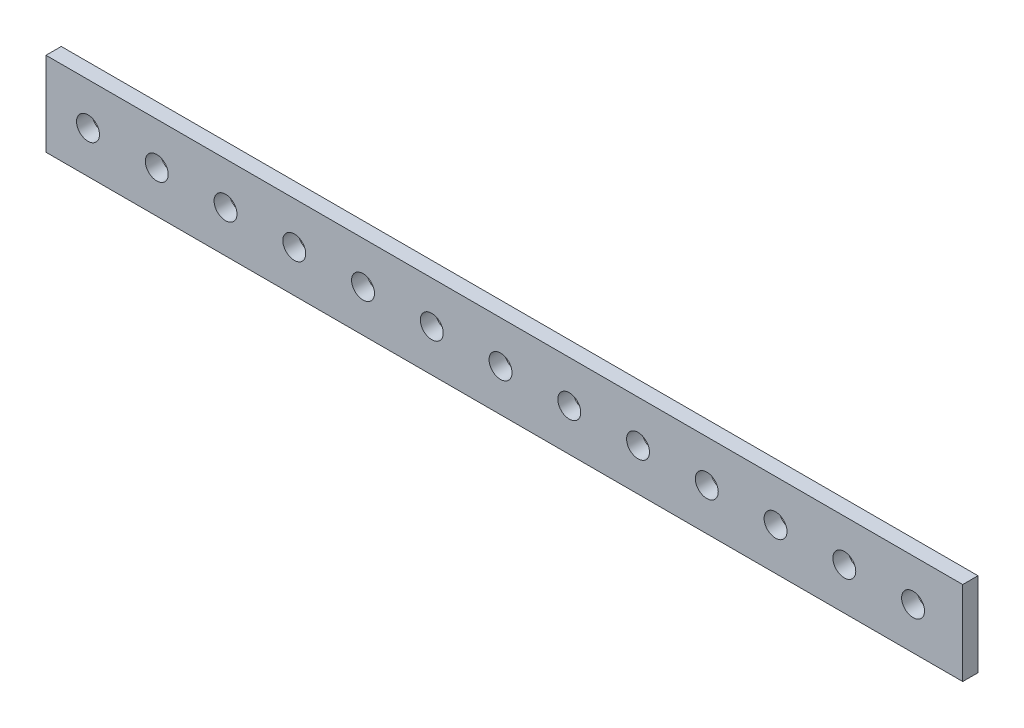
ISO-10303-21;
HEADER;
FILE_DESCRIPTION(('STEP AP214'),'2;1');
FILE_NAME('part.step','',(''),(''),'','','');
FILE_SCHEMA(('AUTOMOTIVE_DESIGN { 1 0 10303 214 1 1 1 1 }'));
ENDSEC;
DATA;
#1=APPLICATION_CONTEXT('core data for automotive mechanical design processes');
#2=APPLICATION_PROTOCOL_DEFINITION('international standard','automotive_design',2000,#1);
#3=PRODUCT_CONTEXT('',#1,'mechanical');
#4=PRODUCT('Part','Part','',(#3));
#5=PRODUCT_RELATED_PRODUCT_CATEGORY('part','',(#4));
#6=PRODUCT_DEFINITION_FORMATION('','',#4);
#7=PRODUCT_DEFINITION_CONTEXT('part definition',#1,'design');
#8=PRODUCT_DEFINITION('design','',#6,#7);
#9=PRODUCT_DEFINITION_SHAPE('','',#8);
#10=(LENGTH_UNIT() NAMED_UNIT(*) SI_UNIT(.MILLI.,.METRE.));
#11=(NAMED_UNIT(*) PLANE_ANGLE_UNIT() SI_UNIT($,.RADIAN.));
#12=(NAMED_UNIT(*) SI_UNIT($,.STERADIAN.) SOLID_ANGLE_UNIT());
#13=UNCERTAINTY_MEASURE_WITH_UNIT(LENGTH_MEASURE(1.E-05),#10,'distance_accuracy_value','');
#14=(GEOMETRIC_REPRESENTATION_CONTEXT(3) GLOBAL_UNCERTAINTY_ASSIGNED_CONTEXT((#13)) GLOBAL_UNIT_ASSIGNED_CONTEXT((#10,
#11,#12)) REPRESENTATION_CONTEXT('',''));
#15=CARTESIAN_POINT('',(0.,0.,0.));
#16=DIRECTION('',(0.,0.,1.));
#17=DIRECTION('',(1.,0.,0.));
#18=AXIS2_PLACEMENT_3D('',#15,#16,#17);
#19=CARTESIAN_POINT('',(1135.,55.,0.));
#20=DIRECTION('',(0.,0.,1.));
#21=DIRECTION('',(1.,0.,0.));
#22=AXIS2_PLACEMENT_3D('',#19,#20,#21);
#23=CYLINDRICAL_SURFACE('',#22,15.);
#24=CARTESIAN_POINT('',(1135.,55.,0.));
#25=DIRECTION('',(0.,0.,1.));
#26=DIRECTION('',(1.,0.,0.));
#27=AXIS2_PLACEMENT_3D('',#24,#25,#26);
#28=CIRCLE('',#27,15.);
#29=CARTESIAN_POINT('',(1150.,55.,0.));
#30=VERTEX_POINT('',#29);
#31=EDGE_CURVE('E54',#30,#30,#28,.T.);
#32=ORIENTED_EDGE('',*,*,#31,.F.);
#33=EDGE_LOOP('',(#32));
#34=FACE_BOUND('',#33,.T.);
#35=CARTESIAN_POINT('',(1135.,55.,20.));
#36=DIRECTION('',(0.,0.,1.));
#37=DIRECTION('',(1.,0.,0.));
#38=AXIS2_PLACEMENT_3D('',#35,#36,#37);
#39=CIRCLE('',#38,15.);
#40=CARTESIAN_POINT('',(1150.,55.,20.));
#41=VERTEX_POINT('',#40);
#42=EDGE_CURVE('E11',#41,#41,#39,.T.);
#43=ORIENTED_EDGE('',*,*,#42,.T.);
#44=EDGE_LOOP('',(#43));
#45=FACE_BOUND('',#44,.T.);
#46=ADVANCED_FACE('F45',(#34,#45),#23,.F.);
#47=CARTESIAN_POINT('',(1045.,55.,0.));
#48=DIRECTION('',(0.,0.,1.));
#49=DIRECTION('',(1.,0.,0.));
#50=AXIS2_PLACEMENT_3D('',#47,#48,#49);
#51=CYLINDRICAL_SURFACE('',#50,15.);
#52=CARTESIAN_POINT('',(1045.,55.,0.));
#53=DIRECTION('',(0.,0.,1.));
#54=DIRECTION('',(1.,0.,0.));
#55=AXIS2_PLACEMENT_3D('',#52,#53,#54);
#56=CIRCLE('',#55,15.);
#57=CARTESIAN_POINT('',(1060.,55.,0.));
#58=VERTEX_POINT('',#57);
#59=EDGE_CURVE('E207',#58,#58,#56,.T.);
#60=ORIENTED_EDGE('',*,*,#59,.F.);
#61=EDGE_LOOP('',(#60));
#62=FACE_BOUND('',#61,.T.);
#63=CARTESIAN_POINT('',(1045.,55.,20.));
#64=DIRECTION('',(0.,0.,1.));
#65=DIRECTION('',(1.,0.,0.));
#66=AXIS2_PLACEMENT_3D('',#63,#64,#65);
#67=CIRCLE('',#66,15.);
#68=CARTESIAN_POINT('',(1060.,55.,20.));
#69=VERTEX_POINT('',#68);
#70=EDGE_CURVE('E211',#69,#69,#67,.T.);
#71=ORIENTED_EDGE('',*,*,#70,.T.);
#72=EDGE_LOOP('',(#71));
#73=FACE_BOUND('',#72,.T.);
#74=ADVANCED_FACE('F222',(#62,#73),#51,.F.);
#75=CARTESIAN_POINT('',(955.,55.,0.));
#76=DIRECTION('',(0.,0.,1.));
#77=DIRECTION('',(1.,0.,0.));
#78=AXIS2_PLACEMENT_3D('',#75,#76,#77);
#79=CYLINDRICAL_SURFACE('',#78,15.);
#80=CARTESIAN_POINT('',(955.,55.,0.));
#81=DIRECTION('',(0.,0.,1.));
#82=DIRECTION('',(1.,0.,0.));
#83=AXIS2_PLACEMENT_3D('',#80,#81,#82);
#84=CIRCLE('',#83,15.);
#85=CARTESIAN_POINT('',(970.,55.,0.));
#86=VERTEX_POINT('',#85);
#87=EDGE_CURVE('E199',#86,#86,#84,.T.);
#88=ORIENTED_EDGE('',*,*,#87,.F.);
#89=EDGE_LOOP('',(#88));
#90=FACE_BOUND('',#89,.T.);
#91=CARTESIAN_POINT('',(955.,55.,20.));
#92=DIRECTION('',(0.,0.,1.));
#93=DIRECTION('',(1.,0.,0.));
#94=AXIS2_PLACEMENT_3D('',#91,#92,#93);
#95=CIRCLE('',#94,15.);
#96=CARTESIAN_POINT('',(970.,55.,20.));
#97=VERTEX_POINT('',#96);
#98=EDGE_CURVE('E203',#97,#97,#95,.T.);
#99=ORIENTED_EDGE('',*,*,#98,.T.);
#100=EDGE_LOOP('',(#99));
#101=FACE_BOUND('',#100,.T.);
#102=ADVANCED_FACE('F281',(#90,#101),#79,.F.);
#103=CARTESIAN_POINT('',(865.,55.,0.));
#104=DIRECTION('',(0.,0.,1.));
#105=DIRECTION('',(1.,0.,0.));
#106=AXIS2_PLACEMENT_3D('',#103,#104,#105);
#107=CYLINDRICAL_SURFACE('',#106,15.);
#108=CARTESIAN_POINT('',(865.,55.,0.));
#109=DIRECTION('',(0.,0.,1.));
#110=DIRECTION('',(1.,0.,0.));
#111=AXIS2_PLACEMENT_3D('',#108,#109,#110);
#112=CIRCLE('',#111,15.);
#113=CARTESIAN_POINT('',(880.,55.,0.));
#114=VERTEX_POINT('',#113);
#115=EDGE_CURVE('E191',#114,#114,#112,.T.);
#116=ORIENTED_EDGE('',*,*,#115,.F.);
#117=EDGE_LOOP('',(#116));
#118=FACE_BOUND('',#117,.T.);
#119=CARTESIAN_POINT('',(865.,55.,20.));
#120=DIRECTION('',(0.,0.,1.));
#121=DIRECTION('',(1.,0.,0.));
#122=AXIS2_PLACEMENT_3D('',#119,#120,#121);
#123=CIRCLE('',#122,15.);
#124=CARTESIAN_POINT('',(880.,55.,20.));
#125=VERTEX_POINT('',#124);
#126=EDGE_CURVE('E195',#125,#125,#123,.T.);
#127=ORIENTED_EDGE('',*,*,#126,.T.);
#128=EDGE_LOOP('',(#127));
#129=FACE_BOUND('',#128,.T.);
#130=ADVANCED_FACE('F277',(#118,#129),#107,.F.);
#131=CARTESIAN_POINT('',(775.,55.,0.));
#132=DIRECTION('',(0.,0.,1.));
#133=DIRECTION('',(1.,0.,0.));
#134=AXIS2_PLACEMENT_3D('',#131,#132,#133);
#135=CYLINDRICAL_SURFACE('',#134,15.);
#136=CARTESIAN_POINT('',(775.,55.,0.));
#137=DIRECTION('',(0.,0.,1.));
#138=DIRECTION('',(1.,0.,0.));
#139=AXIS2_PLACEMENT_3D('',#136,#137,#138);
#140=CIRCLE('',#139,15.);
#141=CARTESIAN_POINT('',(790.,55.,0.));
#142=VERTEX_POINT('',#141);
#143=EDGE_CURVE('E183',#142,#142,#140,.T.);
#144=ORIENTED_EDGE('',*,*,#143,.F.);
#145=EDGE_LOOP('',(#144));
#146=FACE_BOUND('',#145,.T.);
#147=CARTESIAN_POINT('',(775.,55.,20.));
#148=DIRECTION('',(0.,0.,1.));
#149=DIRECTION('',(1.,0.,0.));
#150=AXIS2_PLACEMENT_3D('',#147,#148,#149);
#151=CIRCLE('',#150,15.);
#152=CARTESIAN_POINT('',(790.,55.,20.));
#153=VERTEX_POINT('',#152);
#154=EDGE_CURVE('E187',#153,#153,#151,.T.);
#155=ORIENTED_EDGE('',*,*,#154,.T.);
#156=EDGE_LOOP('',(#155));
#157=FACE_BOUND('',#156,.T.);
#158=ADVANCED_FACE('F273',(#146,#157),#135,.F.);
#159=CARTESIAN_POINT('',(685.,55.,0.));
#160=DIRECTION('',(0.,0.,1.));
#161=DIRECTION('',(1.,0.,0.));
#162=AXIS2_PLACEMENT_3D('',#159,#160,#161);
#163=CYLINDRICAL_SURFACE('',#162,15.);
#164=CARTESIAN_POINT('',(685.,55.,0.));
#165=DIRECTION('',(0.,0.,1.));
#166=DIRECTION('',(1.,0.,0.));
#167=AXIS2_PLACEMENT_3D('',#164,#165,#166);
#168=CIRCLE('',#167,15.);
#169=CARTESIAN_POINT('',(700.,55.,0.));
#170=VERTEX_POINT('',#169);
#171=EDGE_CURVE('E175',#170,#170,#168,.T.);
#172=ORIENTED_EDGE('',*,*,#171,.F.);
#173=EDGE_LOOP('',(#172));
#174=FACE_BOUND('',#173,.T.);
#175=CARTESIAN_POINT('',(685.,55.,20.));
#176=DIRECTION('',(0.,0.,1.));
#177=DIRECTION('',(1.,0.,0.));
#178=AXIS2_PLACEMENT_3D('',#175,#176,#177);
#179=CIRCLE('',#178,15.);
#180=CARTESIAN_POINT('',(700.,55.,20.));
#181=VERTEX_POINT('',#180);
#182=EDGE_CURVE('E179',#181,#181,#179,.T.);
#183=ORIENTED_EDGE('',*,*,#182,.T.);
#184=EDGE_LOOP('',(#183));
#185=FACE_BOUND('',#184,.T.);
#186=ADVANCED_FACE('F269',(#174,#185),#163,.F.);
#187=CARTESIAN_POINT('',(595.,55.,0.));
#188=DIRECTION('',(0.,0.,1.));
#189=DIRECTION('',(1.,0.,0.));
#190=AXIS2_PLACEMENT_3D('',#187,#188,#189);
#191=CYLINDRICAL_SURFACE('',#190,15.);
#192=CARTESIAN_POINT('',(595.,55.,0.));
#193=DIRECTION('',(0.,0.,1.));
#194=DIRECTION('',(1.,0.,0.));
#195=AXIS2_PLACEMENT_3D('',#192,#193,#194);
#196=CIRCLE('',#195,15.);
#197=CARTESIAN_POINT('',(610.,55.,0.));
#198=VERTEX_POINT('',#197);
#199=EDGE_CURVE('E167',#198,#198,#196,.T.);
#200=ORIENTED_EDGE('',*,*,#199,.F.);
#201=EDGE_LOOP('',(#200));
#202=FACE_BOUND('',#201,.T.);
#203=CARTESIAN_POINT('',(595.,55.,20.));
#204=DIRECTION('',(0.,0.,1.));
#205=DIRECTION('',(1.,0.,0.));
#206=AXIS2_PLACEMENT_3D('',#203,#204,#205);
#207=CIRCLE('',#206,15.);
#208=CARTESIAN_POINT('',(610.,55.,20.));
#209=VERTEX_POINT('',#208);
#210=EDGE_CURVE('E171',#209,#209,#207,.T.);
#211=ORIENTED_EDGE('',*,*,#210,.T.);
#212=EDGE_LOOP('',(#211));
#213=FACE_BOUND('',#212,.T.);
#214=ADVANCED_FACE('F265',(#202,#213),#191,.F.);
#215=CARTESIAN_POINT('',(505.,55.,0.));
#216=DIRECTION('',(0.,0.,1.));
#217=DIRECTION('',(1.,0.,0.));
#218=AXIS2_PLACEMENT_3D('',#215,#216,#217);
#219=CYLINDRICAL_SURFACE('',#218,15.);
#220=CARTESIAN_POINT('',(505.,55.,0.));
#221=DIRECTION('',(0.,0.,1.));
#222=DIRECTION('',(1.,0.,0.));
#223=AXIS2_PLACEMENT_3D('',#220,#221,#222);
#224=CIRCLE('',#223,15.);
#225=CARTESIAN_POINT('',(520.,55.,0.));
#226=VERTEX_POINT('',#225);
#227=EDGE_CURVE('E159',#226,#226,#224,.T.);
#228=ORIENTED_EDGE('',*,*,#227,.F.);
#229=EDGE_LOOP('',(#228));
#230=FACE_BOUND('',#229,.T.);
#231=CARTESIAN_POINT('',(505.,55.,20.));
#232=DIRECTION('',(0.,0.,1.));
#233=DIRECTION('',(1.,0.,0.));
#234=AXIS2_PLACEMENT_3D('',#231,#232,#233);
#235=CIRCLE('',#234,15.);
#236=CARTESIAN_POINT('',(520.,55.,20.));
#237=VERTEX_POINT('',#236);
#238=EDGE_CURVE('E163',#237,#237,#235,.T.);
#239=ORIENTED_EDGE('',*,*,#238,.T.);
#240=EDGE_LOOP('',(#239));
#241=FACE_BOUND('',#240,.T.);
#242=ADVANCED_FACE('F261',(#230,#241),#219,.F.);
#243=CARTESIAN_POINT('',(415.,55.,0.));
#244=DIRECTION('',(0.,0.,1.));
#245=DIRECTION('',(1.,0.,0.));
#246=AXIS2_PLACEMENT_3D('',#243,#244,#245);
#247=CYLINDRICAL_SURFACE('',#246,15.);
#248=CARTESIAN_POINT('',(415.,55.,0.));
#249=DIRECTION('',(0.,0.,1.));
#250=DIRECTION('',(1.,0.,0.));
#251=AXIS2_PLACEMENT_3D('',#248,#249,#250);
#252=CIRCLE('',#251,15.);
#253=CARTESIAN_POINT('',(430.,55.,0.));
#254=VERTEX_POINT('',#253);
#255=EDGE_CURVE('E151',#254,#254,#252,.T.);
#256=ORIENTED_EDGE('',*,*,#255,.F.);
#257=EDGE_LOOP('',(#256));
#258=FACE_BOUND('',#257,.T.);
#259=CARTESIAN_POINT('',(415.,55.,20.));
#260=DIRECTION('',(0.,0.,1.));
#261=DIRECTION('',(1.,0.,0.));
#262=AXIS2_PLACEMENT_3D('',#259,#260,#261);
#263=CIRCLE('',#262,15.);
#264=CARTESIAN_POINT('',(430.,55.,20.));
#265=VERTEX_POINT('',#264);
#266=EDGE_CURVE('E155',#265,#265,#263,.T.);
#267=ORIENTED_EDGE('',*,*,#266,.T.);
#268=EDGE_LOOP('',(#267));
#269=FACE_BOUND('',#268,.T.);
#270=ADVANCED_FACE('F257',(#258,#269),#247,.F.);
#271=CARTESIAN_POINT('',(325.,55.,0.));
#272=DIRECTION('',(0.,0.,1.));
#273=DIRECTION('',(1.,0.,0.));
#274=AXIS2_PLACEMENT_3D('',#271,#272,#273);
#275=CYLINDRICAL_SURFACE('',#274,15.);
#276=CARTESIAN_POINT('',(325.,55.,0.));
#277=DIRECTION('',(0.,0.,1.));
#278=DIRECTION('',(1.,0.,0.));
#279=AXIS2_PLACEMENT_3D('',#276,#277,#278);
#280=CIRCLE('',#279,15.);
#281=CARTESIAN_POINT('',(340.,55.,0.));
#282=VERTEX_POINT('',#281);
#283=EDGE_CURVE('E143',#282,#282,#280,.T.);
#284=ORIENTED_EDGE('',*,*,#283,.F.);
#285=EDGE_LOOP('',(#284));
#286=FACE_BOUND('',#285,.T.);
#287=CARTESIAN_POINT('',(325.,55.,20.));
#288=DIRECTION('',(0.,0.,1.));
#289=DIRECTION('',(1.,0.,0.));
#290=AXIS2_PLACEMENT_3D('',#287,#288,#289);
#291=CIRCLE('',#290,15.);
#292=CARTESIAN_POINT('',(340.,55.,20.));
#293=VERTEX_POINT('',#292);
#294=EDGE_CURVE('E147',#293,#293,#291,.T.);
#295=ORIENTED_EDGE('',*,*,#294,.T.);
#296=EDGE_LOOP('',(#295));
#297=FACE_BOUND('',#296,.T.);
#298=ADVANCED_FACE('F253',(#286,#297),#275,.F.);
#299=CARTESIAN_POINT('',(235.,55.,0.));
#300=DIRECTION('',(0.,0.,1.));
#301=DIRECTION('',(1.,0.,0.));
#302=AXIS2_PLACEMENT_3D('',#299,#300,#301);
#303=CYLINDRICAL_SURFACE('',#302,15.);
#304=CARTESIAN_POINT('',(235.,55.,0.));
#305=DIRECTION('',(0.,0.,1.));
#306=DIRECTION('',(1.,0.,0.));
#307=AXIS2_PLACEMENT_3D('',#304,#305,#306);
#308=CIRCLE('',#307,15.);
#309=CARTESIAN_POINT('',(250.,55.,0.));
#310=VERTEX_POINT('',#309);
#311=EDGE_CURVE('E135',#310,#310,#308,.T.);
#312=ORIENTED_EDGE('',*,*,#311,.F.);
#313=EDGE_LOOP('',(#312));
#314=FACE_BOUND('',#313,.T.);
#315=CARTESIAN_POINT('',(235.,55.,20.));
#316=DIRECTION('',(0.,0.,1.));
#317=DIRECTION('',(1.,0.,0.));
#318=AXIS2_PLACEMENT_3D('',#315,#316,#317);
#319=CIRCLE('',#318,15.);
#320=CARTESIAN_POINT('',(250.,55.,20.));
#321=VERTEX_POINT('',#320);
#322=EDGE_CURVE('E139',#321,#321,#319,.T.);
#323=ORIENTED_EDGE('',*,*,#322,.T.);
#324=EDGE_LOOP('',(#323));
#325=FACE_BOUND('',#324,.T.);
#326=ADVANCED_FACE('F250',(#314,#325),#303,.F.);
#327=CARTESIAN_POINT('',(0.,0.,20.));
#328=DIRECTION('',(1.,0.,0.));
#329=DIRECTION('',(0.,0.,-1.));
#330=AXIS2_PLACEMENT_3D('',#327,#328,#329);
#331=PLANE('',#330);
#332=DIRECTION('',(0.,-1.,0.));
#333=VECTOR('',#332,1.);
#334=CARTESIAN_POINT('',(0.,0.,0.));
#335=LINE('',#334,#333);
#336=CARTESIAN_POINT('',(0.,110.,0.));
#337=VERTEX_POINT('',#336);
#338=CARTESIAN_POINT('',(0.,0.,0.));
#339=VERTEX_POINT('',#338);
#340=EDGE_CURVE('E118',#337,#339,#335,.T.);
#341=ORIENTED_EDGE('',*,*,#340,.T.);
#342=DIRECTION('',(0.,0.,-1.));
#343=VECTOR('',#342,1.);
#344=CARTESIAN_POINT('',(0.,0.,20.));
#345=LINE('',#344,#343);
#346=CARTESIAN_POINT('',(0.,0.,20.));
#347=VERTEX_POINT('',#346);
#348=EDGE_CURVE('E107',#347,#339,#345,.T.);
#349=ORIENTED_EDGE('',*,*,#348,.F.);
#350=DIRECTION('',(0.,-1.,0.));
#351=VECTOR('',#350,1.);
#352=CARTESIAN_POINT('',(0.,0.,20.));
#353=LINE('',#352,#351);
#354=CARTESIAN_POINT('',(0.,110.,20.));
#355=VERTEX_POINT('',#354);
#356=EDGE_CURVE('E99',#355,#347,#353,.T.);
#357=ORIENTED_EDGE('',*,*,#356,.F.);
#358=DIRECTION('',(0.,0.,-1.));
#359=VECTOR('',#358,1.);
#360=CARTESIAN_POINT('',(0.,110.,20.));
#361=LINE('',#360,#359);
#362=EDGE_CURVE('E114',#355,#337,#361,.T.);
#363=ORIENTED_EDGE('',*,*,#362,.T.);
#364=EDGE_LOOP('',(#341,#349,#357,#363));
#365=FACE_BOUND('',#364,.T.);
#366=ADVANCED_FACE('F247',(#365),#331,.F.);
#367=CARTESIAN_POINT('',(0.,0.,20.));
#368=DIRECTION('',(0.,1.,0.));
#369=DIRECTION('',(0.,0.,1.));
#370=AXIS2_PLACEMENT_3D('',#367,#368,#369);
#371=PLANE('',#370);
#372=DIRECTION('',(1.,0.,0.));
#373=VECTOR('',#372,1.);
#374=CARTESIAN_POINT('',(0.,0.,0.));
#375=LINE('',#374,#373);
#376=CARTESIAN_POINT('',(1200.,0.,0.));
#377=VERTEX_POINT('',#376);
#378=EDGE_CURVE('E105',#339,#377,#375,.T.);
#379=ORIENTED_EDGE('',*,*,#378,.T.);
#380=DIRECTION('',(0.,0.,-1.));
#381=VECTOR('',#380,1.);
#382=CARTESIAN_POINT('',(1200.,0.,20.));
#383=LINE('',#382,#381);
#384=CARTESIAN_POINT('',(1200.,0.,20.));
#385=VERTEX_POINT('',#384);
#386=EDGE_CURVE('E103',#385,#377,#383,.T.);
#387=ORIENTED_EDGE('',*,*,#386,.F.);
#388=DIRECTION('',(1.,0.,0.));
#389=VECTOR('',#388,1.);
#390=CARTESIAN_POINT('',(0.,0.,20.));
#391=LINE('',#390,#389);
#392=EDGE_CURVE('E93',#347,#385,#391,.T.);
#393=ORIENTED_EDGE('',*,*,#392,.F.);
#394=ORIENTED_EDGE('',*,*,#348,.T.);
#395=EDGE_LOOP('',(#379,#387,#393,#394));
#396=FACE_BOUND('',#395,.T.);
#397=ADVANCED_FACE('F104',(#396),#371,.F.);
#398=CARTESIAN_POINT('',(1200.,0.,20.));
#399=DIRECTION('',(-1.,0.,0.));
#400=DIRECTION('',(0.,0.,1.));
#401=AXIS2_PLACEMENT_3D('',#398,#399,#400);
#402=PLANE('',#401);
#403=DIRECTION('',(0.,1.,0.));
#404=VECTOR('',#403,1.);
#405=CARTESIAN_POINT('',(1200.,0.,0.));
#406=LINE('',#405,#404);
#407=CARTESIAN_POINT('',(1200.,110.,0.));
#408=VERTEX_POINT('',#407);
#409=EDGE_CURVE('E79',#377,#408,#406,.T.);
#410=ORIENTED_EDGE('',*,*,#409,.T.);
#411=DIRECTION('',(0.,0.,-1.));
#412=VECTOR('',#411,1.);
#413=CARTESIAN_POINT('',(1200.,110.,20.));
#414=LINE('',#413,#412);
#415=CARTESIAN_POINT('',(1200.,110.,20.));
#416=VERTEX_POINT('',#415);
#417=EDGE_CURVE('E108',#416,#408,#414,.T.);
#418=ORIENTED_EDGE('',*,*,#417,.F.);
#419=DIRECTION('',(0.,1.,0.));
#420=VECTOR('',#419,1.);
#421=CARTESIAN_POINT('',(1200.,0.,20.));
#422=LINE('',#421,#420);
#423=EDGE_CURVE('E97',#385,#416,#422,.T.);
#424=ORIENTED_EDGE('',*,*,#423,.F.);
#425=ORIENTED_EDGE('',*,*,#386,.T.);
#426=EDGE_LOOP('',(#410,#418,#424,#425));
#427=FACE_BOUND('',#426,.T.);
#428=ADVANCED_FACE('F110',(#427),#402,.F.);
#429=CARTESIAN_POINT('',(0.,110.,20.));
#430=DIRECTION('',(0.,-1.,0.));
#431=DIRECTION('',(0.,0.,-1.));
#432=AXIS2_PLACEMENT_3D('',#429,#430,#431);
#433=PLANE('',#432);
#434=DIRECTION('',(-1.,0.,0.));
#435=VECTOR('',#434,1.);
#436=CARTESIAN_POINT('',(0.,110.,0.));
#437=LINE('',#436,#435);
#438=EDGE_CURVE('E85',#408,#337,#437,.T.);
#439=ORIENTED_EDGE('',*,*,#438,.T.);
#440=ORIENTED_EDGE('',*,*,#362,.F.);
#441=DIRECTION('',(-1.,0.,0.));
#442=VECTOR('',#441,1.);
#443=CARTESIAN_POINT('',(0.,110.,20.));
#444=LINE('',#443,#442);
#445=EDGE_CURVE('E62',#416,#355,#444,.T.);
#446=ORIENTED_EDGE('',*,*,#445,.F.);
#447=ORIENTED_EDGE('',*,*,#417,.T.);
#448=EDGE_LOOP('',(#439,#440,#446,#447));
#449=FACE_BOUND('',#448,.T.);
#450=ADVANCED_FACE('F226',(#449),#433,.F.);
#451=CARTESIAN_POINT('',(0.,0.,20.));
#452=DIRECTION('',(0.,0.,-1.));
#453=DIRECTION('',(-1.,0.,0.));
#454=AXIS2_PLACEMENT_3D('',#451,#452,#453);
#455=PLANE('',#454);
#456=CARTESIAN_POINT('',(145.,55.,20.));
#457=DIRECTION('',(0.,0.,1.));
#458=DIRECTION('',(1.,0.,0.));
#459=AXIS2_PLACEMENT_3D('',#456,#457,#458);
#460=CIRCLE('',#459,15.);
#461=CARTESIAN_POINT('',(160.,55.,20.));
#462=VERTEX_POINT('',#461);
#463=EDGE_CURVE('E416',#462,#462,#460,.T.);
#464=ORIENTED_EDGE('',*,*,#463,.F.);
#465=EDGE_LOOP('',(#464));
#466=FACE_BOUND('',#465,.T.);
#467=CARTESIAN_POINT('',(55.,55.,20.));
#468=DIRECTION('',(0.,0.,1.));
#469=DIRECTION('',(1.,0.,0.));
#470=AXIS2_PLACEMENT_3D('',#467,#468,#469);
#471=CIRCLE('',#470,15.);
#472=CARTESIAN_POINT('',(70.,55.,20.));
#473=VERTEX_POINT('',#472);
#474=EDGE_CURVE('E414',#473,#473,#471,.T.);
#475=ORIENTED_EDGE('',*,*,#474,.F.);
#476=EDGE_LOOP('',(#475));
#477=FACE_BOUND('',#476,.T.);
#478=ORIENTED_EDGE('',*,*,#356,.T.);
#479=ORIENTED_EDGE('',*,*,#392,.T.);
#480=ORIENTED_EDGE('',*,*,#423,.T.);
#481=ORIENTED_EDGE('',*,*,#445,.T.);
#482=EDGE_LOOP('',(#478,#479,#480,#481));
#483=FACE_BOUND('',#482,.T.);
#484=ORIENTED_EDGE('',*,*,#322,.F.);
#485=EDGE_LOOP('',(#484));
#486=FACE_BOUND('',#485,.T.);
#487=ORIENTED_EDGE('',*,*,#294,.F.);
#488=EDGE_LOOP('',(#487));
#489=FACE_BOUND('',#488,.T.);
#490=ORIENTED_EDGE('',*,*,#266,.F.);
#491=EDGE_LOOP('',(#490));
#492=FACE_BOUND('',#491,.T.);
#493=ORIENTED_EDGE('',*,*,#238,.F.);
#494=EDGE_LOOP('',(#493));
#495=FACE_BOUND('',#494,.T.);
#496=ORIENTED_EDGE('',*,*,#210,.F.);
#497=EDGE_LOOP('',(#496));
#498=FACE_BOUND('',#497,.T.);
#499=ORIENTED_EDGE('',*,*,#182,.F.);
#500=EDGE_LOOP('',(#499));
#501=FACE_BOUND('',#500,.T.);
#502=ORIENTED_EDGE('',*,*,#154,.F.);
#503=EDGE_LOOP('',(#502));
#504=FACE_BOUND('',#503,.T.);
#505=ORIENTED_EDGE('',*,*,#126,.F.);
#506=EDGE_LOOP('',(#505));
#507=FACE_BOUND('',#506,.T.);
#508=ORIENTED_EDGE('',*,*,#98,.F.);
#509=EDGE_LOOP('',(#508));
#510=FACE_BOUND('',#509,.T.);
#511=ORIENTED_EDGE('',*,*,#70,.F.);
#512=EDGE_LOOP('',(#511));
#513=FACE_BOUND('',#512,.T.);
#514=ORIENTED_EDGE('',*,*,#42,.F.);
#515=EDGE_LOOP('',(#514));
#516=FACE_BOUND('',#515,.T.);
#517=ADVANCED_FACE('F94',(#466,#477,#483,#486,#489,#492,#495,#498,#501,#504,#507,#510,#513,
#516),#455,.F.);
#518=CARTESIAN_POINT('',(0.,0.,0.));
#519=DIRECTION('',(0.,0.,-1.));
#520=DIRECTION('',(-1.,0.,0.));
#521=AXIS2_PLACEMENT_3D('',#518,#519,#520);
#522=PLANE('',#521);
#523=CARTESIAN_POINT('',(145.,55.,0.));
#524=DIRECTION('',(0.,0.,1.));
#525=DIRECTION('',(1.,0.,0.));
#526=AXIS2_PLACEMENT_3D('',#523,#524,#525);
#527=CIRCLE('',#526,15.);
#528=CARTESIAN_POINT('',(160.,55.,0.));
#529=VERTEX_POINT('',#528);
#530=EDGE_CURVE('E422',#529,#529,#527,.T.);
#531=ORIENTED_EDGE('',*,*,#530,.T.);
#532=EDGE_LOOP('',(#531));
#533=FACE_BOUND('',#532,.T.);
#534=CARTESIAN_POINT('',(55.,55.,0.));
#535=DIRECTION('',(0.,0.,1.));
#536=DIRECTION('',(1.,0.,0.));
#537=AXIS2_PLACEMENT_3D('',#534,#535,#536);
#538=CIRCLE('',#537,15.);
#539=CARTESIAN_POINT('',(70.,55.,0.));
#540=VERTEX_POINT('',#539);
#541=EDGE_CURVE('E122',#540,#540,#538,.T.);
#542=ORIENTED_EDGE('',*,*,#541,.T.);
#543=EDGE_LOOP('',(#542));
#544=FACE_BOUND('',#543,.T.);
#545=ORIENTED_EDGE('',*,*,#340,.F.);
#546=ORIENTED_EDGE('',*,*,#438,.F.);
#547=ORIENTED_EDGE('',*,*,#409,.F.);
#548=ORIENTED_EDGE('',*,*,#378,.F.);
#549=EDGE_LOOP('',(#545,#546,#547,#548));
#550=FACE_BOUND('',#549,.T.);
#551=ORIENTED_EDGE('',*,*,#311,.T.);
#552=EDGE_LOOP('',(#551));
#553=FACE_BOUND('',#552,.T.);
#554=ORIENTED_EDGE('',*,*,#283,.T.);
#555=EDGE_LOOP('',(#554));
#556=FACE_BOUND('',#555,.T.);
#557=ORIENTED_EDGE('',*,*,#255,.T.);
#558=EDGE_LOOP('',(#557));
#559=FACE_BOUND('',#558,.T.);
#560=ORIENTED_EDGE('',*,*,#227,.T.);
#561=EDGE_LOOP('',(#560));
#562=FACE_BOUND('',#561,.T.);
#563=ORIENTED_EDGE('',*,*,#199,.T.);
#564=EDGE_LOOP('',(#563));
#565=FACE_BOUND('',#564,.T.);
#566=ORIENTED_EDGE('',*,*,#171,.T.);
#567=EDGE_LOOP('',(#566));
#568=FACE_BOUND('',#567,.T.);
#569=ORIENTED_EDGE('',*,*,#143,.T.);
#570=EDGE_LOOP('',(#569));
#571=FACE_BOUND('',#570,.T.);
#572=ORIENTED_EDGE('',*,*,#115,.T.);
#573=EDGE_LOOP('',(#572));
#574=FACE_BOUND('',#573,.T.);
#575=ORIENTED_EDGE('',*,*,#87,.T.);
#576=EDGE_LOOP('',(#575));
#577=FACE_BOUND('',#576,.T.);
#578=ORIENTED_EDGE('',*,*,#59,.T.);
#579=EDGE_LOOP('',(#578));
#580=FACE_BOUND('',#579,.T.);
#581=ORIENTED_EDGE('',*,*,#31,.T.);
#582=EDGE_LOOP('',(#581));
#583=FACE_BOUND('',#582,.T.);
#584=ADVANCED_FACE('F218',(#533,#544,#550,#553,#556,#559,#562,#565,#568,#571,#574,#577,#580,
#583),#522,.T.);
#585=CARTESIAN_POINT('',(55.,55.,0.));
#586=DIRECTION('',(0.,0.,1.));
#587=DIRECTION('',(1.,0.,0.));
#588=AXIS2_PLACEMENT_3D('',#585,#586,#587);
#589=CYLINDRICAL_SURFACE('',#588,15.);
#590=ORIENTED_EDGE('',*,*,#541,.F.);
#591=EDGE_LOOP('',(#590));
#592=FACE_BOUND('',#591,.T.);
#593=ORIENTED_EDGE('',*,*,#474,.T.);
#594=EDGE_LOOP('',(#593));
#595=FACE_BOUND('',#594,.T.);
#596=ADVANCED_FACE('F233',(#592,#595),#589,.F.);
#597=CARTESIAN_POINT('',(145.,55.,0.));
#598=DIRECTION('',(0.,0.,1.));
#599=DIRECTION('',(1.,0.,0.));
#600=AXIS2_PLACEMENT_3D('',#597,#598,#599);
#601=CYLINDRICAL_SURFACE('',#600,15.);
#602=ORIENTED_EDGE('',*,*,#530,.F.);
#603=EDGE_LOOP('',(#602));
#604=FACE_BOUND('',#603,.T.);
#605=ORIENTED_EDGE('',*,*,#463,.T.);
#606=EDGE_LOOP('',(#605));
#607=FACE_BOUND('',#606,.T.);
#608=ADVANCED_FACE('F348',(#604,#607),#601,.F.);
#609=CLOSED_SHELL('',(#46,#74,#102,#130,#158,#186,#214,#242,#270,#298,#326,#366,#397,#428,#450,
#517,#584,#596,#608));
#610=MANIFOLD_SOLID_BREP('B2',#609);
#611=ADVANCED_BREP_SHAPE_REPRESENTATION('',(#18,#610),#14);
#612=SHAPE_DEFINITION_REPRESENTATION(#9,#611);
ENDSEC;
END-ISO-10303-21;
